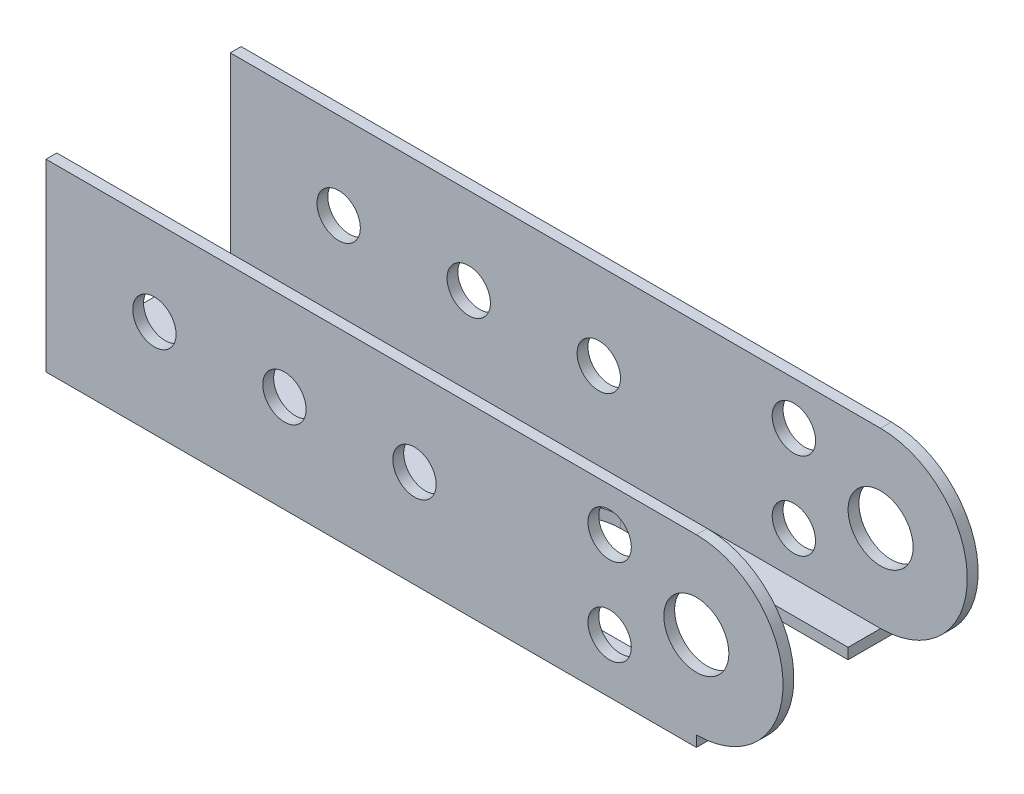
ISO-10303-21;
HEADER;
FILE_DESCRIPTION(('STEP AP214'),'2;1');
FILE_NAME('part.step','',(''),(''),'','','');
FILE_SCHEMA(('AUTOMOTIVE_DESIGN { 1 0 10303 214 1 1 1 1 }'));
ENDSEC;
DATA;
#1=APPLICATION_CONTEXT('core data for automotive mechanical design processes');
#2=APPLICATION_PROTOCOL_DEFINITION('international standard','automotive_design',2000,#1);
#3=PRODUCT_CONTEXT('',#1,'mechanical');
#4=PRODUCT('Part','Part','',(#3));
#5=PRODUCT_RELATED_PRODUCT_CATEGORY('part','',(#4));
#6=PRODUCT_DEFINITION_FORMATION('','',#4);
#7=PRODUCT_DEFINITION_CONTEXT('part definition',#1,'design');
#8=PRODUCT_DEFINITION('design','',#6,#7);
#9=PRODUCT_DEFINITION_SHAPE('','',#8);
#10=(LENGTH_UNIT() NAMED_UNIT(*) SI_UNIT(.MILLI.,.METRE.));
#11=(NAMED_UNIT(*) PLANE_ANGLE_UNIT() SI_UNIT($,.RADIAN.));
#12=(NAMED_UNIT(*) SI_UNIT($,.STERADIAN.) SOLID_ANGLE_UNIT());
#13=UNCERTAINTY_MEASURE_WITH_UNIT(LENGTH_MEASURE(1.E-05),#10,'distance_accuracy_value','');
#14=(GEOMETRIC_REPRESENTATION_CONTEXT(3) GLOBAL_UNCERTAINTY_ASSIGNED_CONTEXT((#13)) GLOBAL_UNIT_ASSIGNED_CONTEXT((#10,
#11,#12)) REPRESENTATION_CONTEXT('',''));
#15=CARTESIAN_POINT('',(0.,0.,0.));
#16=DIRECTION('',(0.,0.,1.));
#17=DIRECTION('',(1.,0.,0.));
#18=AXIS2_PLACEMENT_3D('',#15,#16,#17);
#19=CARTESIAN_POINT('',(15.,0.,8.5));
#20=DIRECTION('',(0.,0.,1.));
#21=DIRECTION('',(1.,0.,0.));
#22=AXIS2_PLACEMENT_3D('',#19,#20,#21);
#23=PLANE('',#22);
#24=CARTESIAN_POINT('',(-3.99999999999999,0.,8.5));
#25=DIRECTION('',(0.,0.,1.));
#26=DIRECTION('',(1.,0.,0.));
#27=AXIS2_PLACEMENT_3D('',#24,#25,#26);
#28=CIRCLE('',#27,1.);
#29=CARTESIAN_POINT('',(-2.99999999999999,0.,8.5));
#30=VERTEX_POINT('',#29);
#31=EDGE_CURVE('E225',#30,#30,#28,.T.);
#32=ORIENTED_EDGE('',*,*,#31,.F.);
#33=EDGE_LOOP('',(#32));
#34=FACE_BOUND('',#33,.T.);
#35=CARTESIAN_POINT('',(11.,2.,8.5));
#36=DIRECTION('',(0.,0.,1.));
#37=DIRECTION('',(1.,0.,0.));
#38=AXIS2_PLACEMENT_3D('',#35,#36,#37);
#39=CIRCLE('',#38,1.);
#40=CARTESIAN_POINT('',(12.,2.,8.5));
#41=VERTEX_POINT('',#40);
#42=EDGE_CURVE('E237',#41,#41,#39,.T.);
#43=ORIENTED_EDGE('',*,*,#42,.F.);
#44=EDGE_LOOP('',(#43));
#45=FACE_BOUND('',#44,.T.);
#46=CARTESIAN_POINT('',(15.,0.,8.5));
#47=DIRECTION('',(0.,0.,1.));
#48=DIRECTION('',(1.,0.,0.));
#49=AXIS2_PLACEMENT_3D('',#46,#47,#48);
#50=CIRCLE('',#49,1.5);
#51=CARTESIAN_POINT('',(16.5,0.,8.5));
#52=VERTEX_POINT('',#51);
#53=EDGE_CURVE('E249',#52,#52,#50,.T.);
#54=ORIENTED_EDGE('',*,*,#53,.F.);
#55=EDGE_LOOP('',(#54));
#56=FACE_BOUND('',#55,.T.);
#57=DIRECTION('',(0.,-1.,0.));
#58=VECTOR('',#57,1.);
#59=CARTESIAN_POINT('',(-15.,4.,8.5));
#60=LINE('',#59,#58);
#61=CARTESIAN_POINT('',(-15.,4.,8.5));
#62=VERTEX_POINT('',#61);
#63=CARTESIAN_POINT('',(-15.,-4.5,8.5));
#64=VERTEX_POINT('',#63);
#65=EDGE_CURVE('E255',#62,#64,#60,.T.);
#66=ORIENTED_EDGE('',*,*,#65,.T.);
#67=DIRECTION('',(1.,0.,0.));
#68=VECTOR('',#67,1.);
#69=CARTESIAN_POINT('',(2.00000000000001,-4.5,8.5));
#70=LINE('',#69,#68);
#71=CARTESIAN_POINT('',(15.,-4.5,8.5));
#72=VERTEX_POINT('',#71);
#73=EDGE_CURVE('E182',#64,#72,#70,.T.);
#74=ORIENTED_EDGE('',*,*,#73,.T.);
#75=DIRECTION('',(0.,1.,0.));
#76=VECTOR('',#75,1.);
#77=CARTESIAN_POINT('',(15.,-4.5,8.5));
#78=LINE('',#77,#76);
#79=CARTESIAN_POINT('',(15.,-4.,8.5));
#80=VERTEX_POINT('',#79);
#81=EDGE_CURVE('E198',#72,#80,#78,.T.);
#82=ORIENTED_EDGE('',*,*,#81,.T.);
#83=CARTESIAN_POINT('',(15.,0.,8.5));
#84=DIRECTION('',(0.,0.,1.));
#85=DIRECTION('',(1.,0.,0.));
#86=AXIS2_PLACEMENT_3D('',#83,#84,#85);
#87=CIRCLE('',#86,4.);
#88=CARTESIAN_POINT('',(15.,4.,8.5));
#89=VERTEX_POINT('',#88);
#90=EDGE_CURVE('E257',#80,#89,#87,.T.);
#91=ORIENTED_EDGE('',*,*,#90,.T.);
#92=DIRECTION('',(-1.,0.,0.));
#93=VECTOR('',#92,1.);
#94=CARTESIAN_POINT('',(15.,4.,8.5));
#95=LINE('',#94,#93);
#96=EDGE_CURVE('E260',#89,#62,#95,.T.);
#97=ORIENTED_EDGE('',*,*,#96,.T.);
#98=EDGE_LOOP('',(#66,#74,#82,#91,#97));
#99=FACE_BOUND('',#98,.T.);
#100=CARTESIAN_POINT('',(11.,-2.,8.5));
#101=DIRECTION('',(0.,0.,1.));
#102=DIRECTION('',(1.,0.,0.));
#103=AXIS2_PLACEMENT_3D('',#100,#101,#102);
#104=CIRCLE('',#103,1.);
#105=CARTESIAN_POINT('',(12.,-2.,8.5));
#106=VERTEX_POINT('',#105);
#107=EDGE_CURVE('E243',#106,#106,#104,.T.);
#108=ORIENTED_EDGE('',*,*,#107,.F.);
#109=EDGE_LOOP('',(#108));
#110=FACE_BOUND('',#109,.T.);
#111=CARTESIAN_POINT('',(2.00000000000001,0.,8.5));
#112=DIRECTION('',(0.,0.,1.));
#113=DIRECTION('',(1.,0.,0.));
#114=AXIS2_PLACEMENT_3D('',#111,#112,#113);
#115=CIRCLE('',#114,1.);
#116=CARTESIAN_POINT('',(3.00000000000001,0.,8.5));
#117=VERTEX_POINT('',#116);
#118=EDGE_CURVE('E231',#117,#117,#115,.T.);
#119=ORIENTED_EDGE('',*,*,#118,.F.);
#120=EDGE_LOOP('',(#119));
#121=FACE_BOUND('',#120,.T.);
#122=CARTESIAN_POINT('',(-9.99999999999999,0.,8.5));
#123=DIRECTION('',(0.,0.,1.));
#124=DIRECTION('',(1.,0.,0.));
#125=AXIS2_PLACEMENT_3D('',#122,#123,#124);
#126=CIRCLE('',#125,1.);
#127=CARTESIAN_POINT('',(-9.,0.,8.5));
#128=VERTEX_POINT('',#127);
#129=EDGE_CURVE('E219',#128,#128,#126,.T.);
#130=ORIENTED_EDGE('',*,*,#129,.F.);
#131=EDGE_LOOP('',(#130));
#132=FACE_BOUND('',#131,.T.);
#133=ADVANCED_FACE('F36',(#34,#45,#56,#99,#110,#121,#132),#23,.T.);
#134=CARTESIAN_POINT('',(15.,0.,8.));
#135=DIRECTION('',(0.,0.,1.));
#136=DIRECTION('',(1.,0.,0.));
#137=AXIS2_PLACEMENT_3D('',#134,#135,#136);
#138=PLANE('',#137);
#139=DIRECTION('',(0.,-1.,0.));
#140=VECTOR('',#139,1.);
#141=CARTESIAN_POINT('',(-15.,4.,8.));
#142=LINE('',#141,#140);
#143=CARTESIAN_POINT('',(-15.,4.,8.));
#144=VERTEX_POINT('',#143);
#145=CARTESIAN_POINT('',(-15.,-4.,8.));
#146=VERTEX_POINT('',#145);
#147=EDGE_CURVE('E252',#144,#146,#142,.T.);
#148=ORIENTED_EDGE('',*,*,#147,.F.);
#149=DIRECTION('',(-1.,0.,0.));
#150=VECTOR('',#149,1.);
#151=CARTESIAN_POINT('',(15.,4.,8.));
#152=LINE('',#151,#150);
#153=CARTESIAN_POINT('',(15.,4.,8.));
#154=VERTEX_POINT('',#153);
#155=EDGE_CURVE('E258',#154,#144,#152,.T.);
#156=ORIENTED_EDGE('',*,*,#155,.F.);
#157=CARTESIAN_POINT('',(15.,0.,8.));
#158=DIRECTION('',(0.,0.,1.));
#159=DIRECTION('',(1.,0.,0.));
#160=AXIS2_PLACEMENT_3D('',#157,#158,#159);
#161=CIRCLE('',#160,4.);
#162=CARTESIAN_POINT('',(15.,-4.,8.));
#163=VERTEX_POINT('',#162);
#164=EDGE_CURVE('E268',#163,#154,#161,.T.);
#165=ORIENTED_EDGE('',*,*,#164,.F.);
#166=DIRECTION('',(1.,0.,0.));
#167=VECTOR('',#166,1.);
#168=CARTESIAN_POINT('',(-15.,-4.,8.));
#169=LINE('',#168,#167);
#170=EDGE_CURVE('E265',#146,#163,#169,.T.);
#171=ORIENTED_EDGE('',*,*,#170,.F.);
#172=EDGE_LOOP('',(#148,#156,#165,#171));
#173=FACE_BOUND('',#172,.T.);
#174=CARTESIAN_POINT('',(15.,0.,8.));
#175=DIRECTION('',(0.,0.,1.));
#176=DIRECTION('',(1.,0.,0.));
#177=AXIS2_PLACEMENT_3D('',#174,#175,#176);
#178=CIRCLE('',#177,1.5);
#179=CARTESIAN_POINT('',(16.5,0.,8.));
#180=VERTEX_POINT('',#179);
#181=EDGE_CURVE('E246',#180,#180,#178,.T.);
#182=ORIENTED_EDGE('',*,*,#181,.T.);
#183=EDGE_LOOP('',(#182));
#184=FACE_BOUND('',#183,.T.);
#185=CARTESIAN_POINT('',(11.,-2.,8.));
#186=DIRECTION('',(0.,0.,1.));
#187=DIRECTION('',(1.,0.,0.));
#188=AXIS2_PLACEMENT_3D('',#185,#186,#187);
#189=CIRCLE('',#188,1.);
#190=CARTESIAN_POINT('',(12.,-2.,8.));
#191=VERTEX_POINT('',#190);
#192=EDGE_CURVE('E240',#191,#191,#189,.T.);
#193=ORIENTED_EDGE('',*,*,#192,.T.);
#194=EDGE_LOOP('',(#193));
#195=FACE_BOUND('',#194,.T.);
#196=CARTESIAN_POINT('',(11.,2.,8.));
#197=DIRECTION('',(0.,0.,1.));
#198=DIRECTION('',(1.,0.,0.));
#199=AXIS2_PLACEMENT_3D('',#196,#197,#198);
#200=CIRCLE('',#199,1.);
#201=CARTESIAN_POINT('',(12.,2.,8.));
#202=VERTEX_POINT('',#201);
#203=EDGE_CURVE('E234',#202,#202,#200,.T.);
#204=ORIENTED_EDGE('',*,*,#203,.T.);
#205=EDGE_LOOP('',(#204));
#206=FACE_BOUND('',#205,.T.);
#207=CARTESIAN_POINT('',(2.00000000000001,0.,8.));
#208=DIRECTION('',(0.,0.,1.));
#209=DIRECTION('',(1.,0.,0.));
#210=AXIS2_PLACEMENT_3D('',#207,#208,#209);
#211=CIRCLE('',#210,1.);
#212=CARTESIAN_POINT('',(3.00000000000001,0.,8.));
#213=VERTEX_POINT('',#212);
#214=EDGE_CURVE('E228',#213,#213,#211,.T.);
#215=ORIENTED_EDGE('',*,*,#214,.T.);
#216=EDGE_LOOP('',(#215));
#217=FACE_BOUND('',#216,.T.);
#218=CARTESIAN_POINT('',(-3.99999999999999,0.,8.));
#219=DIRECTION('',(0.,0.,1.));
#220=DIRECTION('',(1.,0.,0.));
#221=AXIS2_PLACEMENT_3D('',#218,#219,#220);
#222=CIRCLE('',#221,1.);
#223=CARTESIAN_POINT('',(-2.99999999999999,0.,8.));
#224=VERTEX_POINT('',#223);
#225=EDGE_CURVE('E222',#224,#224,#222,.T.);
#226=ORIENTED_EDGE('',*,*,#225,.T.);
#227=EDGE_LOOP('',(#226));
#228=FACE_BOUND('',#227,.T.);
#229=CARTESIAN_POINT('',(-9.99999999999999,0.,8.));
#230=DIRECTION('',(0.,0.,1.));
#231=DIRECTION('',(1.,0.,0.));
#232=AXIS2_PLACEMENT_3D('',#229,#230,#231);
#233=CIRCLE('',#232,1.);
#234=CARTESIAN_POINT('',(-9.,0.,8.));
#235=VERTEX_POINT('',#234);
#236=EDGE_CURVE('E209',#235,#235,#233,.T.);
#237=ORIENTED_EDGE('',*,*,#236,.T.);
#238=EDGE_LOOP('',(#237));
#239=FACE_BOUND('',#238,.T.);
#240=ADVANCED_FACE('F354',(#173,#184,#195,#206,#217,#228,#239),#138,.F.);
#241=CARTESIAN_POINT('',(-15.,4.,8.5));
#242=DIRECTION('',(1.,0.,0.));
#243=DIRECTION('',(0.,0.,-1.));
#244=AXIS2_PLACEMENT_3D('',#241,#242,#243);
#245=PLANE('',#244);
#246=ORIENTED_EDGE('',*,*,#147,.T.);
#247=DIRECTION('',(0.,0.,1.));
#248=VECTOR('',#247,1.);
#249=CARTESIAN_POINT('',(-15.,-4.,8.5));
#250=LINE('',#249,#248);
#251=CARTESIAN_POINT('',(-15.,-4.,0.));
#252=VERTEX_POINT('',#251);
#253=EDGE_CURVE('E177',#252,#146,#250,.T.);
#254=ORIENTED_EDGE('',*,*,#253,.F.);
#255=DIRECTION('',(0.,-1.,0.));
#256=VECTOR('',#255,1.);
#257=CARTESIAN_POINT('',(-15.,4.,0.));
#258=LINE('',#257,#256);
#259=CARTESIAN_POINT('',(-15.,4.,0.));
#260=VERTEX_POINT('',#259);
#261=EDGE_CURVE('E164',#260,#252,#258,.T.);
#262=ORIENTED_EDGE('',*,*,#261,.F.);
#263=DIRECTION('',(0.,0.,1.));
#264=VECTOR('',#263,1.);
#265=CARTESIAN_POINT('',(-15.,4.,-0.5));
#266=LINE('',#265,#264);
#267=CARTESIAN_POINT('',(-15.,4.,-0.5));
#268=VERTEX_POINT('',#267);
#269=EDGE_CURVE('E147',#268,#260,#266,.T.);
#270=ORIENTED_EDGE('',*,*,#269,.F.);
#271=DIRECTION('',(0.,1.,0.));
#272=VECTOR('',#271,1.);
#273=CARTESIAN_POINT('',(-15.,-4.5,-0.5));
#274=LINE('',#273,#272);
#275=CARTESIAN_POINT('',(-15.,-4.5,-0.5));
#276=VERTEX_POINT('',#275);
#277=EDGE_CURVE('E155',#276,#268,#274,.T.);
#278=ORIENTED_EDGE('',*,*,#277,.F.);
#279=DIRECTION('',(0.,0.,1.));
#280=VECTOR('',#279,1.);
#281=CARTESIAN_POINT('',(-15.,-4.5,8.5));
#282=LINE('',#281,#280);
#283=EDGE_CURVE('E179',#276,#64,#282,.T.);
#284=ORIENTED_EDGE('',*,*,#283,.T.);
#285=ORIENTED_EDGE('',*,*,#65,.F.);
#286=DIRECTION('',(0.,0.,-1.));
#287=VECTOR('',#286,1.);
#288=CARTESIAN_POINT('',(-15.,4.,8.5));
#289=LINE('',#288,#287);
#290=EDGE_CURVE('E262',#62,#144,#289,.T.);
#291=ORIENTED_EDGE('',*,*,#290,.T.);
#292=EDGE_LOOP('',(#246,#254,#262,#270,#278,#284,#285,#291));
#293=FACE_BOUND('',#292,.T.);
#294=ADVANCED_FACE('F348',(#293),#245,.F.);
#295=CARTESIAN_POINT('',(15.,0.,8.5));
#296=DIRECTION('',(0.,0.,-1.));
#297=DIRECTION('',(-1.,0.,0.));
#298=AXIS2_PLACEMENT_3D('',#295,#296,#297);
#299=CYLINDRICAL_SURFACE('',#298,4.);
#300=ORIENTED_EDGE('',*,*,#164,.T.);
#301=DIRECTION('',(0.,0.,-1.));
#302=VECTOR('',#301,1.);
#303=CARTESIAN_POINT('',(15.,4.,8.5));
#304=LINE('',#303,#302);
#305=EDGE_CURVE('E273',#89,#154,#304,.T.);
#306=ORIENTED_EDGE('',*,*,#305,.F.);
#307=ORIENTED_EDGE('',*,*,#90,.F.);
#308=DIRECTION('',(0.,0.,-1.));
#309=VECTOR('',#308,1.);
#310=CARTESIAN_POINT('',(15.,-4.,8.5));
#311=LINE('',#310,#309);
#312=EDGE_CURVE('E276',#80,#163,#311,.T.);
#313=ORIENTED_EDGE('',*,*,#312,.T.);
#314=EDGE_LOOP('',(#300,#306,#307,#313));
#315=FACE_BOUND('',#314,.T.);
#316=ADVANCED_FACE('F360',(#315),#299,.T.);
#317=CARTESIAN_POINT('',(15.,4.,8.5));
#318=DIRECTION('',(0.,-1.,0.));
#319=DIRECTION('',(0.,0.,-1.));
#320=AXIS2_PLACEMENT_3D('',#317,#318,#319);
#321=PLANE('',#320);
#322=ORIENTED_EDGE('',*,*,#155,.T.);
#323=ORIENTED_EDGE('',*,*,#290,.F.);
#324=ORIENTED_EDGE('',*,*,#96,.F.);
#325=ORIENTED_EDGE('',*,*,#305,.T.);
#326=EDGE_LOOP('',(#322,#323,#324,#325));
#327=FACE_BOUND('',#326,.T.);
#328=ADVANCED_FACE('F379',(#327),#321,.F.);
#329=CARTESIAN_POINT('',(15.,0.,8.5));
#330=DIRECTION('',(0.,0.,-1.));
#331=DIRECTION('',(-1.,0.,0.));
#332=AXIS2_PLACEMENT_3D('',#329,#330,#331);
#333=CYLINDRICAL_SURFACE('',#332,1.5);
#334=ORIENTED_EDGE('',*,*,#53,.T.);
#335=EDGE_LOOP('',(#334));
#336=FACE_BOUND('',#335,.T.);
#337=ORIENTED_EDGE('',*,*,#181,.F.);
#338=EDGE_LOOP('',(#337));
#339=FACE_BOUND('',#338,.T.);
#340=ADVANCED_FACE('F381',(#336,#339),#333,.F.);
#341=CARTESIAN_POINT('',(11.,-2.,8.5));
#342=DIRECTION('',(0.,0.,-1.));
#343=DIRECTION('',(-1.,0.,0.));
#344=AXIS2_PLACEMENT_3D('',#341,#342,#343);
#345=CYLINDRICAL_SURFACE('',#344,1.);
#346=ORIENTED_EDGE('',*,*,#107,.T.);
#347=EDGE_LOOP('',(#346));
#348=FACE_BOUND('',#347,.T.);
#349=ORIENTED_EDGE('',*,*,#192,.F.);
#350=EDGE_LOOP('',(#349));
#351=FACE_BOUND('',#350,.T.);
#352=ADVANCED_FACE('F387',(#348,#351),#345,.F.);
#353=CARTESIAN_POINT('',(11.,2.,8.5));
#354=DIRECTION('',(0.,0.,-1.));
#355=DIRECTION('',(-1.,0.,0.));
#356=AXIS2_PLACEMENT_3D('',#353,#354,#355);
#357=CYLINDRICAL_SURFACE('',#356,1.);
#358=ORIENTED_EDGE('',*,*,#42,.T.);
#359=EDGE_LOOP('',(#358));
#360=FACE_BOUND('',#359,.T.);
#361=ORIENTED_EDGE('',*,*,#203,.F.);
#362=EDGE_LOOP('',(#361));
#363=FACE_BOUND('',#362,.T.);
#364=ADVANCED_FACE('F403',(#360,#363),#357,.F.);
#365=CARTESIAN_POINT('',(2.00000000000001,0.,8.5));
#366=DIRECTION('',(0.,0.,-1.));
#367=DIRECTION('',(-1.,0.,0.));
#368=AXIS2_PLACEMENT_3D('',#365,#366,#367);
#369=CYLINDRICAL_SURFACE('',#368,1.);
#370=ORIENTED_EDGE('',*,*,#118,.T.);
#371=EDGE_LOOP('',(#370));
#372=FACE_BOUND('',#371,.T.);
#373=ORIENTED_EDGE('',*,*,#214,.F.);
#374=EDGE_LOOP('',(#373));
#375=FACE_BOUND('',#374,.T.);
#376=ADVANCED_FACE('F407',(#372,#375),#369,.F.);
#377=CARTESIAN_POINT('',(-3.99999999999999,0.,8.5));
#378=DIRECTION('',(0.,0.,-1.));
#379=DIRECTION('',(-1.,0.,0.));
#380=AXIS2_PLACEMENT_3D('',#377,#378,#379);
#381=CYLINDRICAL_SURFACE('',#380,1.);
#382=ORIENTED_EDGE('',*,*,#31,.T.);
#383=EDGE_LOOP('',(#382));
#384=FACE_BOUND('',#383,.T.);
#385=ORIENTED_EDGE('',*,*,#225,.F.);
#386=EDGE_LOOP('',(#385));
#387=FACE_BOUND('',#386,.T.);
#388=ADVANCED_FACE('F411',(#384,#387),#381,.F.);
#389=CARTESIAN_POINT('',(-9.99999999999999,0.,8.5));
#390=DIRECTION('',(0.,0.,-1.));
#391=DIRECTION('',(-1.,0.,0.));
#392=AXIS2_PLACEMENT_3D('',#389,#390,#391);
#393=CYLINDRICAL_SURFACE('',#392,1.);
#394=ORIENTED_EDGE('',*,*,#129,.T.);
#395=EDGE_LOOP('',(#394));
#396=FACE_BOUND('',#395,.T.);
#397=ORIENTED_EDGE('',*,*,#236,.F.);
#398=EDGE_LOOP('',(#397));
#399=FACE_BOUND('',#398,.T.);
#400=ADVANCED_FACE('F415',(#396,#399),#393,.F.);
#401=CARTESIAN_POINT('',(0.,-4.,0.));
#402=DIRECTION('',(0.,-1.,0.));
#403=DIRECTION('',(0.,0.,-1.));
#404=AXIS2_PLACEMENT_3D('',#401,#402,#403);
#405=PLANE('',#404);
#406=DIRECTION('',(0.,0.,-1.));
#407=VECTOR('',#406,1.);
#408=CARTESIAN_POINT('',(15.,-4.,-0.5));
#409=LINE('',#408,#407);
#410=CARTESIAN_POINT('',(15.,-4.,1.5));
#411=VERTEX_POINT('',#410);
#412=CARTESIAN_POINT('',(15.,-4.,0.));
#413=VERTEX_POINT('',#412);
#414=EDGE_CURVE('E183',#411,#413,#409,.T.);
#415=ORIENTED_EDGE('',*,*,#414,.T.);
#416=DIRECTION('',(1.,0.,0.));
#417=VECTOR('',#416,1.);
#418=CARTESIAN_POINT('',(-15.,-4.,0.));
#419=LINE('',#418,#417);
#420=EDGE_CURVE('E161',#252,#413,#419,.T.);
#421=ORIENTED_EDGE('',*,*,#420,.F.);
#422=ORIENTED_EDGE('',*,*,#253,.T.);
#423=ORIENTED_EDGE('',*,*,#170,.T.);
#424=DIRECTION('',(0.,0.,-1.));
#425=VECTOR('',#424,1.);
#426=CARTESIAN_POINT('',(15.,-4.,8.5));
#427=LINE('',#426,#425);
#428=CARTESIAN_POINT('',(15.,-4.,6.5));
#429=VERTEX_POINT('',#428);
#430=EDGE_CURVE('E200',#163,#429,#427,.T.);
#431=ORIENTED_EDGE('',*,*,#430,.T.);
#432=DIRECTION('',(-1.,0.,0.));
#433=VECTOR('',#432,1.);
#434=CARTESIAN_POINT('',(2.00000000000001,-4.,6.5));
#435=LINE('',#434,#433);
#436=CARTESIAN_POINT('',(4.50000000000001,-4.,6.5));
#437=VERTEX_POINT('',#436);
#438=EDGE_CURVE('E202',#429,#437,#435,.T.);
#439=ORIENTED_EDGE('',*,*,#438,.T.);
#440=CARTESIAN_POINT('',(4.50000000000001,-4.,4.));
#441=DIRECTION('',(0.,-1.,0.));
#442=DIRECTION('',(0.,0.,-1.));
#443=AXIS2_PLACEMENT_3D('',#440,#441,#442);
#444=CIRCLE('',#443,2.5);
#445=CARTESIAN_POINT('',(2.00000000000001,-4.,4.));
#446=VERTEX_POINT('',#445);
#447=EDGE_CURVE('E45',#437,#446,#444,.T.);
#448=ORIENTED_EDGE('',*,*,#447,.T.);
#449=CARTESIAN_POINT('',(4.50000000000001,-4.,4.));
#450=DIRECTION('',(0.,-1.,0.));
#451=DIRECTION('',(0.,0.,-1.));
#452=AXIS2_PLACEMENT_3D('',#449,#450,#451);
#453=CIRCLE('',#452,2.5);
#454=CARTESIAN_POINT('',(4.50000000000001,-4.,1.5));
#455=VERTEX_POINT('',#454);
#456=EDGE_CURVE('E284',#446,#455,#453,.T.);
#457=ORIENTED_EDGE('',*,*,#456,.T.);
#458=DIRECTION('',(1.,0.,0.));
#459=VECTOR('',#458,1.);
#460=CARTESIAN_POINT('',(2.00000000000001,-4.,1.5));
#461=LINE('',#460,#459);
#462=EDGE_CURVE('E204',#455,#411,#461,.T.);
#463=ORIENTED_EDGE('',*,*,#462,.T.);
#464=EDGE_LOOP('',(#415,#421,#422,#423,#431,#439,#448,#457,#463));
#465=FACE_BOUND('',#464,.T.);
#466=ADVANCED_FACE('F289',(#465),#405,.F.);
#467=CARTESIAN_POINT('',(-15.,-4.5,-0.5));
#468=DIRECTION('',(0.,0.,-1.));
#469=DIRECTION('',(-1.,0.,0.));
#470=AXIS2_PLACEMENT_3D('',#467,#468,#469);
#471=PLANE('',#470);
#472=ORIENTED_EDGE('',*,*,#277,.T.);
#473=DIRECTION('',(-1.,0.,0.));
#474=VECTOR('',#473,1.);
#475=CARTESIAN_POINT('',(-15.,4.,-0.5));
#476=LINE('',#475,#474);
#477=CARTESIAN_POINT('',(15.,4.,-0.5));
#478=VERTEX_POINT('',#477);
#479=EDGE_CURVE('E140',#478,#268,#476,.T.);
#480=ORIENTED_EDGE('',*,*,#479,.F.);
#481=CARTESIAN_POINT('',(15.,0.,-0.5));
#482=DIRECTION('',(0.,0.,1.));
#483=DIRECTION('',(1.,0.,0.));
#484=AXIS2_PLACEMENT_3D('',#481,#482,#483);
#485=CIRCLE('',#484,4.);
#486=CARTESIAN_POINT('',(15.,-4.,-0.5));
#487=VERTEX_POINT('',#486);
#488=EDGE_CURVE('E153',#487,#478,#485,.T.);
#489=ORIENTED_EDGE('',*,*,#488,.F.);
#490=DIRECTION('',(0.,1.,0.));
#491=VECTOR('',#490,1.);
#492=CARTESIAN_POINT('',(15.,-4.5,-0.5));
#493=LINE('',#492,#491);
#494=CARTESIAN_POINT('',(15.,-4.5,-0.5));
#495=VERTEX_POINT('',#494);
#496=EDGE_CURVE('E210',#495,#487,#493,.T.);
#497=ORIENTED_EDGE('',*,*,#496,.F.);
#498=DIRECTION('',(-1.,0.,0.));
#499=VECTOR('',#498,1.);
#500=CARTESIAN_POINT('',(2.00000000000001,-4.5,-0.5));
#501=LINE('',#500,#499);
#502=EDGE_CURVE('E196',#495,#276,#501,.T.);
#503=ORIENTED_EDGE('',*,*,#502,.T.);
#504=EDGE_LOOP('',(#472,#480,#489,#497,#503));
#505=FACE_BOUND('',#504,.T.);
#506=CARTESIAN_POINT('',(11.,-2.,-0.5));
#507=DIRECTION('',(0.,0.,1.));
#508=DIRECTION('',(1.,0.,0.));
#509=AXIS2_PLACEMENT_3D('',#506,#507,#508);
#510=CIRCLE('',#509,1.);
#511=CARTESIAN_POINT('',(12.,-2.,-0.5));
#512=VERTEX_POINT('',#511);
#513=EDGE_CURVE('E301',#512,#512,#510,.T.);
#514=ORIENTED_EDGE('',*,*,#513,.T.);
#515=EDGE_LOOP('',(#514));
#516=FACE_BOUND('',#515,.T.);
#517=CARTESIAN_POINT('',(11.,2.,-0.5));
#518=DIRECTION('',(0.,0.,1.));
#519=DIRECTION('',(1.,0.,0.));
#520=AXIS2_PLACEMENT_3D('',#517,#518,#519);
#521=CIRCLE('',#520,1.);
#522=CARTESIAN_POINT('',(12.,2.,-0.5));
#523=VERTEX_POINT('',#522);
#524=EDGE_CURVE('E309',#523,#523,#521,.T.);
#525=ORIENTED_EDGE('',*,*,#524,.T.);
#526=EDGE_LOOP('',(#525));
#527=FACE_BOUND('',#526,.T.);
#528=CARTESIAN_POINT('',(2.00000000000001,0.,-0.5));
#529=DIRECTION('',(0.,0.,1.));
#530=DIRECTION('',(1.,0.,0.));
#531=AXIS2_PLACEMENT_3D('',#528,#529,#530);
#532=CIRCLE('',#531,1.);
#533=CARTESIAN_POINT('',(3.00000000000001,0.,-0.5));
#534=VERTEX_POINT('',#533);
#535=EDGE_CURVE('E315',#534,#534,#532,.T.);
#536=ORIENTED_EDGE('',*,*,#535,.T.);
#537=EDGE_LOOP('',(#536));
#538=FACE_BOUND('',#537,.T.);
#539=CARTESIAN_POINT('',(-3.99999999999999,0.,-0.5));
#540=DIRECTION('',(0.,0.,1.));
#541=DIRECTION('',(1.,0.,0.));
#542=AXIS2_PLACEMENT_3D('',#539,#540,#541);
#543=CIRCLE('',#542,1.);
#544=CARTESIAN_POINT('',(-2.99999999999999,0.,-0.5));
#545=VERTEX_POINT('',#544);
#546=EDGE_CURVE('E321',#545,#545,#543,.T.);
#547=ORIENTED_EDGE('',*,*,#546,.T.);
#548=EDGE_LOOP('',(#547));
#549=FACE_BOUND('',#548,.T.);
#550=CARTESIAN_POINT('',(-9.99999999999999,0.,-0.5));
#551=DIRECTION('',(0.,0.,1.));
#552=DIRECTION('',(1.,0.,0.));
#553=AXIS2_PLACEMENT_3D('',#550,#551,#552);
#554=CIRCLE('',#553,1.);
#555=CARTESIAN_POINT('',(-9.,0.,-0.5));
#556=VERTEX_POINT('',#555);
#557=EDGE_CURVE('E327',#556,#556,#554,.T.);
#558=ORIENTED_EDGE('',*,*,#557,.T.);
#559=EDGE_LOOP('',(#558));
#560=FACE_BOUND('',#559,.T.);
#561=CARTESIAN_POINT('',(15.,0.,-0.5));
#562=DIRECTION('',(0.,0.,1.));
#563=DIRECTION('',(1.,0.,0.));
#564=AXIS2_PLACEMENT_3D('',#561,#562,#563);
#565=CIRCLE('',#564,1.5);
#566=CARTESIAN_POINT('',(16.5,0.,-0.5));
#567=VERTEX_POINT('',#566);
#568=EDGE_CURVE('E172',#567,#567,#565,.T.);
#569=ORIENTED_EDGE('',*,*,#568,.T.);
#570=EDGE_LOOP('',(#569));
#571=FACE_BOUND('',#570,.T.);
#572=ADVANCED_FACE('F151',(#505,#516,#527,#538,#549,#560,#571),#471,.T.);
#573=CARTESIAN_POINT('',(15.,-4.5,-0.5));
#574=DIRECTION('',(1.,0.,0.));
#575=DIRECTION('',(0.,0.,-1.));
#576=AXIS2_PLACEMENT_3D('',#573,#574,#575);
#577=PLANE('',#576);
#578=ORIENTED_EDGE('',*,*,#414,.F.);
#579=DIRECTION('',(0.,1.,0.));
#580=VECTOR('',#579,1.);
#581=CARTESIAN_POINT('',(15.,-4.5,1.5));
#582=LINE('',#581,#580);
#583=CARTESIAN_POINT('',(15.,-4.5,1.5));
#584=VERTEX_POINT('',#583);
#585=EDGE_CURVE('E212',#584,#411,#582,.T.);
#586=ORIENTED_EDGE('',*,*,#585,.F.);
#587=DIRECTION('',(0.,0.,-1.));
#588=VECTOR('',#587,1.);
#589=CARTESIAN_POINT('',(15.,-4.5,-0.5));
#590=LINE('',#589,#588);
#591=EDGE_CURVE('E193',#584,#495,#590,.T.);
#592=ORIENTED_EDGE('',*,*,#591,.T.);
#593=ORIENTED_EDGE('',*,*,#496,.T.);
#594=DIRECTION('',(0.,0.,1.));
#595=VECTOR('',#594,1.);
#596=CARTESIAN_POINT('',(15.,-4.,-0.5));
#597=LINE('',#596,#595);
#598=EDGE_CURVE('E160',#487,#413,#597,.T.);
#599=ORIENTED_EDGE('',*,*,#598,.T.);
#600=EDGE_LOOP('',(#578,#586,#592,#593,#599));
#601=FACE_BOUND('',#600,.T.);
#602=ADVANCED_FACE('F426',(#601),#577,.T.);
#603=CARTESIAN_POINT('',(2.00000000000001,-4.5,1.5));
#604=DIRECTION('',(0.,0.,1.));
#605=DIRECTION('',(1.,0.,0.));
#606=AXIS2_PLACEMENT_3D('',#603,#604,#605);
#607=PLANE('',#606);
#608=ORIENTED_EDGE('',*,*,#462,.F.);
#609=DIRECTION('',(0.,1.,0.));
#610=VECTOR('',#609,1.);
#611=CARTESIAN_POINT('',(4.50000000000001,-4.5,1.5));
#612=LINE('',#611,#610);
#613=CARTESIAN_POINT('',(4.50000000000001,-4.5,1.5));
#614=VERTEX_POINT('',#613);
#615=EDGE_CURVE('E279',#455,#614,#612,.F.);
#616=ORIENTED_EDGE('',*,*,#615,.T.);
#617=DIRECTION('',(1.,0.,0.));
#618=VECTOR('',#617,1.);
#619=CARTESIAN_POINT('',(2.00000000000001,-4.5,1.5));
#620=LINE('',#619,#618);
#621=EDGE_CURVE('E191',#614,#584,#620,.T.);
#622=ORIENTED_EDGE('',*,*,#621,.T.);
#623=ORIENTED_EDGE('',*,*,#585,.T.);
#624=EDGE_LOOP('',(#608,#616,#622,#623));
#625=FACE_BOUND('',#624,.T.);
#626=ADVANCED_FACE('F294',(#625),#607,.T.);
#627=CARTESIAN_POINT('',(2.00000000000001,-4.5,6.5));
#628=DIRECTION('',(0.,0.,-1.));
#629=DIRECTION('',(-1.,0.,0.));
#630=AXIS2_PLACEMENT_3D('',#627,#628,#629);
#631=PLANE('',#630);
#632=DIRECTION('',(-1.,0.,0.));
#633=VECTOR('',#632,1.);
#634=CARTESIAN_POINT('',(2.00000000000001,-4.5,6.5));
#635=LINE('',#634,#633);
#636=CARTESIAN_POINT('',(15.,-4.5,6.5));
#637=VERTEX_POINT('',#636);
#638=CARTESIAN_POINT('',(4.50000000000001,-4.5,6.5));
#639=VERTEX_POINT('',#638);
#640=EDGE_CURVE('E188',#637,#639,#635,.T.);
#641=ORIENTED_EDGE('',*,*,#640,.T.);
#642=DIRECTION('',(0.,1.,0.));
#643=VECTOR('',#642,1.);
#644=CARTESIAN_POINT('',(4.50000000000001,-4.,6.5));
#645=LINE('',#644,#643);
#646=EDGE_CURVE('E282',#639,#437,#645,.T.);
#647=ORIENTED_EDGE('',*,*,#646,.T.);
#648=ORIENTED_EDGE('',*,*,#438,.F.);
#649=DIRECTION('',(0.,1.,0.));
#650=VECTOR('',#649,1.);
#651=CARTESIAN_POINT('',(15.,-4.5,6.5));
#652=LINE('',#651,#650);
#653=EDGE_CURVE('E215',#637,#429,#652,.T.);
#654=ORIENTED_EDGE('',*,*,#653,.F.);
#655=EDGE_LOOP('',(#641,#647,#648,#654));
#656=FACE_BOUND('',#655,.T.);
#657=ADVANCED_FACE('F369',(#656),#631,.T.);
#658=CARTESIAN_POINT('',(15.,-4.5,8.5));
#659=DIRECTION('',(1.,0.,0.));
#660=DIRECTION('',(0.,0.,-1.));
#661=AXIS2_PLACEMENT_3D('',#658,#659,#660);
#662=PLANE('',#661);
#663=ORIENTED_EDGE('',*,*,#312,.F.);
#664=ORIENTED_EDGE('',*,*,#81,.F.);
#665=DIRECTION('',(0.,0.,-1.));
#666=VECTOR('',#665,1.);
#667=CARTESIAN_POINT('',(15.,-4.5,8.5));
#668=LINE('',#667,#666);
#669=EDGE_CURVE('E185',#72,#637,#668,.T.);
#670=ORIENTED_EDGE('',*,*,#669,.T.);
#671=ORIENTED_EDGE('',*,*,#653,.T.);
#672=ORIENTED_EDGE('',*,*,#430,.F.);
#673=EDGE_LOOP('',(#663,#664,#670,#671,#672));
#674=FACE_BOUND('',#673,.T.);
#675=ADVANCED_FACE('F364',(#674),#662,.T.);
#676=CARTESIAN_POINT('',(0.,-4.5,0.));
#677=DIRECTION('',(0.,-1.,0.));
#678=DIRECTION('',(0.,0.,-1.));
#679=AXIS2_PLACEMENT_3D('',#676,#677,#678);
#680=PLANE('',#679);
#681=ORIENTED_EDGE('',*,*,#283,.F.);
#682=ORIENTED_EDGE('',*,*,#502,.F.);
#683=ORIENTED_EDGE('',*,*,#591,.F.);
#684=ORIENTED_EDGE('',*,*,#621,.F.);
#685=CARTESIAN_POINT('',(4.50000000000001,-4.5,4.));
#686=DIRECTION('',(0.,-1.,0.));
#687=DIRECTION('',(0.,0.,-1.));
#688=AXIS2_PLACEMENT_3D('',#685,#686,#687);
#689=CIRCLE('',#688,2.5);
#690=CARTESIAN_POINT('',(2.00000000000001,-4.5,4.));
#691=VERTEX_POINT('',#690);
#692=EDGE_CURVE('E51',#614,#691,#689,.F.);
#693=ORIENTED_EDGE('',*,*,#692,.T.);
#694=CARTESIAN_POINT('',(4.50000000000001,-4.5,4.));
#695=DIRECTION('',(0.,-1.,0.));
#696=DIRECTION('',(0.,0.,-1.));
#697=AXIS2_PLACEMENT_3D('',#694,#695,#696);
#698=CIRCLE('',#697,2.5);
#699=EDGE_CURVE('E11',#691,#639,#698,.F.);
#700=ORIENTED_EDGE('',*,*,#699,.T.);
#701=ORIENTED_EDGE('',*,*,#640,.F.);
#702=ORIENTED_EDGE('',*,*,#669,.F.);
#703=ORIENTED_EDGE('',*,*,#73,.F.);
#704=EDGE_LOOP('',(#681,#682,#683,#684,#693,#700,#701,#702,#703));
#705=FACE_BOUND('',#704,.T.);
#706=ADVANCED_FACE('F372',(#705),#680,.T.);
#707=CARTESIAN_POINT('',(15.,0.,-0.5));
#708=DIRECTION('',(0.,0.,1.));
#709=DIRECTION('',(1.,0.,0.));
#710=AXIS2_PLACEMENT_3D('',#707,#708,#709);
#711=CYLINDRICAL_SURFACE('',#710,4.);
#712=CARTESIAN_POINT('',(15.,0.,0.));
#713=DIRECTION('',(0.,0.,1.));
#714=DIRECTION('',(1.,0.,0.));
#715=AXIS2_PLACEMENT_3D('',#712,#713,#714);
#716=CIRCLE('',#715,4.);
#717=CARTESIAN_POINT('',(15.,4.,0.));
#718=VERTEX_POINT('',#717);
#719=EDGE_CURVE('E170',#413,#718,#716,.T.);
#720=ORIENTED_EDGE('',*,*,#719,.F.);
#721=ORIENTED_EDGE('',*,*,#598,.F.);
#722=ORIENTED_EDGE('',*,*,#488,.T.);
#723=DIRECTION('',(0.,0.,1.));
#724=VECTOR('',#723,1.);
#725=CARTESIAN_POINT('',(15.,4.,-0.5));
#726=LINE('',#725,#724);
#727=EDGE_CURVE('E137',#478,#718,#726,.T.);
#728=ORIENTED_EDGE('',*,*,#727,.T.);
#729=EDGE_LOOP('',(#720,#721,#722,#728));
#730=FACE_BOUND('',#729,.T.);
#731=ADVANCED_FACE('F159',(#730),#711,.T.);
#732=CARTESIAN_POINT('',(-15.,4.,-0.5));
#733=DIRECTION('',(0.,1.,0.));
#734=DIRECTION('',(0.,0.,1.));
#735=AXIS2_PLACEMENT_3D('',#732,#733,#734);
#736=PLANE('',#735);
#737=DIRECTION('',(-1.,0.,0.));
#738=VECTOR('',#737,1.);
#739=CARTESIAN_POINT('',(-15.,4.,0.));
#740=LINE('',#739,#738);
#741=EDGE_CURVE('E142',#718,#260,#740,.T.);
#742=ORIENTED_EDGE('',*,*,#741,.F.);
#743=ORIENTED_EDGE('',*,*,#727,.F.);
#744=ORIENTED_EDGE('',*,*,#479,.T.);
#745=ORIENTED_EDGE('',*,*,#269,.T.);
#746=EDGE_LOOP('',(#742,#743,#744,#745));
#747=FACE_BOUND('',#746,.T.);
#748=ADVANCED_FACE('F139',(#747),#736,.T.);
#749=CARTESIAN_POINT('',(15.,0.,0.));
#750=DIRECTION('',(0.,0.,1.));
#751=DIRECTION('',(1.,0.,0.));
#752=AXIS2_PLACEMENT_3D('',#749,#750,#751);
#753=PLANE('',#752);
#754=CARTESIAN_POINT('',(11.,-2.,0.));
#755=DIRECTION('',(0.,0.,1.));
#756=DIRECTION('',(1.,0.,0.));
#757=AXIS2_PLACEMENT_3D('',#754,#755,#756);
#758=CIRCLE('',#757,1.);
#759=CARTESIAN_POINT('',(12.,-2.,0.));
#760=VERTEX_POINT('',#759);
#761=EDGE_CURVE('E299',#760,#760,#758,.T.);
#762=ORIENTED_EDGE('',*,*,#761,.F.);
#763=EDGE_LOOP('',(#762));
#764=FACE_BOUND('',#763,.T.);
#765=CARTESIAN_POINT('',(11.,2.,0.));
#766=DIRECTION('',(0.,0.,1.));
#767=DIRECTION('',(1.,0.,0.));
#768=AXIS2_PLACEMENT_3D('',#765,#766,#767);
#769=CIRCLE('',#768,1.);
#770=CARTESIAN_POINT('',(12.,2.,0.));
#771=VERTEX_POINT('',#770);
#772=EDGE_CURVE('E306',#771,#771,#769,.T.);
#773=ORIENTED_EDGE('',*,*,#772,.F.);
#774=EDGE_LOOP('',(#773));
#775=FACE_BOUND('',#774,.T.);
#776=CARTESIAN_POINT('',(2.00000000000001,0.,0.));
#777=DIRECTION('',(0.,0.,1.));
#778=DIRECTION('',(1.,0.,0.));
#779=AXIS2_PLACEMENT_3D('',#776,#777,#778);
#780=CIRCLE('',#779,1.);
#781=CARTESIAN_POINT('',(3.00000000000001,0.,0.));
#782=VERTEX_POINT('',#781);
#783=EDGE_CURVE('E312',#782,#782,#780,.T.);
#784=ORIENTED_EDGE('',*,*,#783,.F.);
#785=EDGE_LOOP('',(#784));
#786=FACE_BOUND('',#785,.T.);
#787=CARTESIAN_POINT('',(-3.99999999999999,0.,0.));
#788=DIRECTION('',(0.,0.,1.));
#789=DIRECTION('',(1.,0.,0.));
#790=AXIS2_PLACEMENT_3D('',#787,#788,#789);
#791=CIRCLE('',#790,1.);
#792=CARTESIAN_POINT('',(-2.99999999999999,0.,0.));
#793=VERTEX_POINT('',#792);
#794=EDGE_CURVE('E318',#793,#793,#791,.T.);
#795=ORIENTED_EDGE('',*,*,#794,.F.);
#796=EDGE_LOOP('',(#795));
#797=FACE_BOUND('',#796,.T.);
#798=CARTESIAN_POINT('',(-9.99999999999999,0.,0.));
#799=DIRECTION('',(0.,0.,1.));
#800=DIRECTION('',(1.,0.,0.));
#801=AXIS2_PLACEMENT_3D('',#798,#799,#800);
#802=CIRCLE('',#801,1.);
#803=CARTESIAN_POINT('',(-9.,0.,0.));
#804=VERTEX_POINT('',#803);
#805=EDGE_CURVE('E324',#804,#804,#802,.T.);
#806=ORIENTED_EDGE('',*,*,#805,.F.);
#807=EDGE_LOOP('',(#806));
#808=FACE_BOUND('',#807,.T.);
#809=CARTESIAN_POINT('',(15.,0.,0.));
#810=DIRECTION('',(0.,0.,1.));
#811=DIRECTION('',(1.,0.,0.));
#812=AXIS2_PLACEMENT_3D('',#809,#810,#811);
#813=CIRCLE('',#812,1.5);
#814=CARTESIAN_POINT('',(16.5,0.,0.));
#815=VERTEX_POINT('',#814);
#816=EDGE_CURVE('E167',#815,#815,#813,.T.);
#817=ORIENTED_EDGE('',*,*,#816,.F.);
#818=EDGE_LOOP('',(#817));
#819=FACE_BOUND('',#818,.T.);
#820=ORIENTED_EDGE('',*,*,#719,.T.);
#821=ORIENTED_EDGE('',*,*,#741,.T.);
#822=ORIENTED_EDGE('',*,*,#261,.T.);
#823=ORIENTED_EDGE('',*,*,#420,.T.);
#824=EDGE_LOOP('',(#820,#821,#822,#823));
#825=FACE_BOUND('',#824,.T.);
#826=ADVANCED_FACE('F339',(#764,#775,#786,#797,#808,#819,#825),#753,.T.);
#827=CARTESIAN_POINT('',(15.,0.,-0.5));
#828=DIRECTION('',(0.,0.,1.));
#829=DIRECTION('',(1.,0.,0.));
#830=AXIS2_PLACEMENT_3D('',#827,#828,#829);
#831=CYLINDRICAL_SURFACE('',#830,1.5);
#832=ORIENTED_EDGE('',*,*,#568,.F.);
#833=EDGE_LOOP('',(#832));
#834=FACE_BOUND('',#833,.T.);
#835=ORIENTED_EDGE('',*,*,#816,.T.);
#836=EDGE_LOOP('',(#835));
#837=FACE_BOUND('',#836,.T.);
#838=ADVANCED_FACE('F337',(#834,#837),#831,.F.);
#839=CARTESIAN_POINT('',(-9.99999999999999,0.,-0.5));
#840=DIRECTION('',(0.,0.,1.));
#841=DIRECTION('',(1.,0.,0.));
#842=AXIS2_PLACEMENT_3D('',#839,#840,#841);
#843=CYLINDRICAL_SURFACE('',#842,1.);
#844=ORIENTED_EDGE('',*,*,#557,.F.);
#845=EDGE_LOOP('',(#844));
#846=FACE_BOUND('',#845,.T.);
#847=ORIENTED_EDGE('',*,*,#805,.T.);
#848=EDGE_LOOP('',(#847));
#849=FACE_BOUND('',#848,.T.);
#850=ADVANCED_FACE('F442',(#846,#849),#843,.F.);
#851=CARTESIAN_POINT('',(-3.99999999999999,0.,-0.5));
#852=DIRECTION('',(0.,0.,1.));
#853=DIRECTION('',(1.,0.,0.));
#854=AXIS2_PLACEMENT_3D('',#851,#852,#853);
#855=CYLINDRICAL_SURFACE('',#854,1.);
#856=ORIENTED_EDGE('',*,*,#546,.F.);
#857=EDGE_LOOP('',(#856));
#858=FACE_BOUND('',#857,.T.);
#859=ORIENTED_EDGE('',*,*,#794,.T.);
#860=EDGE_LOOP('',(#859));
#861=FACE_BOUND('',#860,.T.);
#862=ADVANCED_FACE('F446',(#858,#861),#855,.F.);
#863=CARTESIAN_POINT('',(2.00000000000001,0.,-0.5));
#864=DIRECTION('',(0.,0.,1.));
#865=DIRECTION('',(1.,0.,0.));
#866=AXIS2_PLACEMENT_3D('',#863,#864,#865);
#867=CYLINDRICAL_SURFACE('',#866,1.);
#868=ORIENTED_EDGE('',*,*,#535,.F.);
#869=EDGE_LOOP('',(#868));
#870=FACE_BOUND('',#869,.T.);
#871=ORIENTED_EDGE('',*,*,#783,.T.);
#872=EDGE_LOOP('',(#871));
#873=FACE_BOUND('',#872,.T.);
#874=ADVANCED_FACE('F450',(#870,#873),#867,.F.);
#875=CARTESIAN_POINT('',(11.,2.,-0.5));
#876=DIRECTION('',(0.,0.,1.));
#877=DIRECTION('',(1.,0.,0.));
#878=AXIS2_PLACEMENT_3D('',#875,#876,#877);
#879=CYLINDRICAL_SURFACE('',#878,1.);
#880=ORIENTED_EDGE('',*,*,#524,.F.);
#881=EDGE_LOOP('',(#880));
#882=FACE_BOUND('',#881,.T.);
#883=ORIENTED_EDGE('',*,*,#772,.T.);
#884=EDGE_LOOP('',(#883));
#885=FACE_BOUND('',#884,.T.);
#886=ADVANCED_FACE('F454',(#882,#885),#879,.F.);
#887=CARTESIAN_POINT('',(11.,-2.,-0.5));
#888=DIRECTION('',(0.,0.,1.));
#889=DIRECTION('',(1.,0.,0.));
#890=AXIS2_PLACEMENT_3D('',#887,#888,#889);
#891=CYLINDRICAL_SURFACE('',#890,1.);
#892=ORIENTED_EDGE('',*,*,#513,.F.);
#893=EDGE_LOOP('',(#892));
#894=FACE_BOUND('',#893,.T.);
#895=ORIENTED_EDGE('',*,*,#761,.T.);
#896=EDGE_LOOP('',(#895));
#897=FACE_BOUND('',#896,.T.);
#898=ADVANCED_FACE('F458',(#894,#897),#891,.F.);
#899=CARTESIAN_POINT('',(4.50000000000001,-4.5,4.));
#900=DIRECTION('',(0.,-1.,0.));
#901=DIRECTION('',(0.,0.,-1.));
#902=AXIS2_PLACEMENT_3D('',#899,#900,#901);
#903=CYLINDRICAL_SURFACE('',#902,2.5);
#904=ORIENTED_EDGE('',*,*,#646,.F.);
#905=ORIENTED_EDGE('',*,*,#699,.F.);
#906=DIRECTION('',(0.,1.,0.));
#907=VECTOR('',#906,1.);
#908=CARTESIAN_POINT('',(2.00000000000001,-4.5,4.));
#909=LINE('',#908,#907);
#910=EDGE_CURVE('E40',#446,#691,#909,.F.);
#911=ORIENTED_EDGE('',*,*,#910,.F.);
#912=ORIENTED_EDGE('',*,*,#447,.F.);
#913=EDGE_LOOP('',(#904,#905,#911,#912));
#914=FACE_BOUND('',#913,.T.);
#915=ADVANCED_FACE('F38',(#914),#903,.F.);
#916=CARTESIAN_POINT('',(4.50000000000001,-4.5,4.));
#917=DIRECTION('',(0.,-1.,0.));
#918=DIRECTION('',(0.,0.,-1.));
#919=AXIS2_PLACEMENT_3D('',#916,#917,#918);
#920=CYLINDRICAL_SURFACE('',#919,2.5);
#921=ORIENTED_EDGE('',*,*,#692,.F.);
#922=ORIENTED_EDGE('',*,*,#615,.F.);
#923=ORIENTED_EDGE('',*,*,#456,.F.);
#924=ORIENTED_EDGE('',*,*,#910,.T.);
#925=EDGE_LOOP('',(#921,#922,#923,#924));
#926=FACE_BOUND('',#925,.T.);
#927=ADVANCED_FACE('F297',(#926),#920,.F.);
#928=CLOSED_SHELL('',(#133,#240,#294,#316,#328,#340,#352,#364,#376,#388,#400,#466,#572,#602,
#626,#657,#675,#706,#731,#748,#826,#838,#850,#862,#874,#886,#898,#915,#927));
#929=MANIFOLD_SOLID_BREP('B2',#928);
#930=ADVANCED_BREP_SHAPE_REPRESENTATION('',(#18,#929),#14);
#931=SHAPE_DEFINITION_REPRESENTATION(#9,#930);
ENDSEC;
END-ISO-10303-21;
